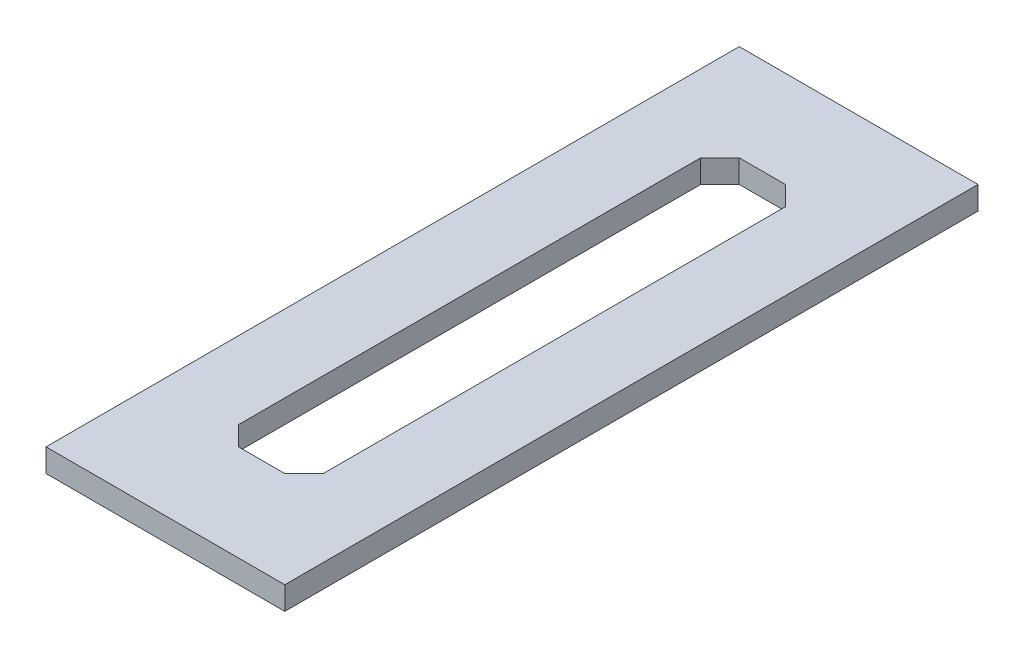
ISO-10303-21;
HEADER;
FILE_DESCRIPTION(('STEP AP214'),'2;1');
FILE_NAME('part.step','',(''),(''),'','','');
FILE_SCHEMA(('AUTOMOTIVE_DESIGN { 1 0 10303 214 1 1 1 1 }'));
ENDSEC;
DATA;
#1=APPLICATION_CONTEXT('core data for automotive mechanical design processes');
#2=APPLICATION_PROTOCOL_DEFINITION('international standard','automotive_design',2000,#1);
#3=PRODUCT_CONTEXT('',#1,'mechanical');
#4=PRODUCT('Part','Part','',(#3));
#5=PRODUCT_RELATED_PRODUCT_CATEGORY('part','',(#4));
#6=PRODUCT_DEFINITION_FORMATION('','',#4);
#7=PRODUCT_DEFINITION_CONTEXT('part definition',#1,'design');
#8=PRODUCT_DEFINITION('design','',#6,#7);
#9=PRODUCT_DEFINITION_SHAPE('','',#8);
#10=(LENGTH_UNIT() NAMED_UNIT(*) SI_UNIT(.MILLI.,.METRE.));
#11=(NAMED_UNIT(*) PLANE_ANGLE_UNIT() SI_UNIT($,.RADIAN.));
#12=(NAMED_UNIT(*) SI_UNIT($,.STERADIAN.) SOLID_ANGLE_UNIT());
#13=UNCERTAINTY_MEASURE_WITH_UNIT(LENGTH_MEASURE(1.E-05),#10,'distance_accuracy_value','');
#14=(GEOMETRIC_REPRESENTATION_CONTEXT(3) GLOBAL_UNCERTAINTY_ASSIGNED_CONTEXT((#13)) GLOBAL_UNIT_ASSIGNED_CONTEXT((#10,
#11,#12)) REPRESENTATION_CONTEXT('',''));
#15=CARTESIAN_POINT('',(0.,0.,0.));
#16=DIRECTION('',(0.,0.,1.));
#17=DIRECTION('',(1.,0.,0.));
#18=AXIS2_PLACEMENT_3D('',#15,#16,#17);
#19=CARTESIAN_POINT('',(0.,6.,0.));
#20=DIRECTION('',(0.,-1.,0.));
#21=DIRECTION('',(0.,0.,-1.));
#22=AXIS2_PLACEMENT_3D('',#19,#20,#21);
#23=PLANE('',#22);
#24=DIRECTION('',(0.,0.,1.));
#25=VECTOR('',#24,1.);
#26=CARTESIAN_POINT('',(-85.3503836317135,6.,70.2046035805626));
#27=LINE('',#26,#25);
#28=CARTESIAN_POINT('',(-85.3503836317135,6.,-109.795396419437));
#29=VERTEX_POINT('',#28);
#30=CARTESIAN_POINT('',(-85.3503836317135,6.,70.2046035805626));
#31=VERTEX_POINT('',#30);
#32=EDGE_CURVE('E222',#29,#31,#27,.T.);
#33=ORIENTED_EDGE('',*,*,#32,.T.);
#34=DIRECTION('',(1.,0.,0.));
#35=VECTOR('',#34,1.);
#36=CARTESIAN_POINT('',(-85.3503836317135,6.,70.2046035805626));
#37=LINE('',#36,#35);
#38=CARTESIAN_POINT('',(-23.3503836317135,6.,70.2046035805626));
#39=VERTEX_POINT('',#38);
#40=EDGE_CURVE('E226',#31,#39,#37,.T.);
#41=ORIENTED_EDGE('',*,*,#40,.T.);
#42=DIRECTION('',(0.,0.,-1.));
#43=VECTOR('',#42,1.);
#44=CARTESIAN_POINT('',(-23.3503836317135,6.,70.2046035805626));
#45=LINE('',#44,#43);
#46=CARTESIAN_POINT('',(-23.3503836317135,6.,-109.795396419437));
#47=VERTEX_POINT('',#46);
#48=EDGE_CURVE('E230',#39,#47,#45,.T.);
#49=ORIENTED_EDGE('',*,*,#48,.T.);
#50=DIRECTION('',(-1.,0.,0.));
#51=VECTOR('',#50,1.);
#52=CARTESIAN_POINT('',(-85.3503836317135,6.,-109.795396419437));
#53=LINE('',#52,#51);
#54=EDGE_CURVE('E233',#47,#29,#53,.T.);
#55=ORIENTED_EDGE('',*,*,#54,.T.);
#56=EDGE_LOOP('',(#33,#41,#49,#55));
#57=FACE_BOUND('',#56,.T.);
#58=DIRECTION('',(-1.,0.,0.));
#59=VECTOR('',#58,1.);
#60=CARTESIAN_POINT('',(-60.3503836317135,6.,-84.7953964194373));
#61=LINE('',#60,#59);
#62=CARTESIAN_POINT('',(-48.3503836317135,6.,-84.7953964194373));
#63=VERTEX_POINT('',#62);
#64=CARTESIAN_POINT('',(-60.3503836317135,6.,-84.7953964194373));
#65=VERTEX_POINT('',#64);
#66=EDGE_CURVE('E133',#63,#65,#61,.T.);
#67=ORIENTED_EDGE('',*,*,#66,.F.);
#68=DIRECTION('',(-0.707106781186547,0.,-0.707106781186548));
#69=VECTOR('',#68,1.);
#70=CARTESIAN_POINT('',(-48.3503836317135,6.,-84.7953964194373));
#71=LINE('',#70,#69);
#72=CARTESIAN_POINT('',(-43.3503836317135,6.,-79.7953964194373));
#73=VERTEX_POINT('',#72);
#74=EDGE_CURVE('E174',#73,#63,#71,.T.);
#75=ORIENTED_EDGE('',*,*,#74,.F.);
#76=DIRECTION('',(0.,0.,-1.));
#77=VECTOR('',#76,1.);
#78=CARTESIAN_POINT('',(-43.3503836317135,6.,40.2046035805627));
#79=LINE('',#78,#77);
#80=CARTESIAN_POINT('',(-43.3503836317135,6.,40.2046035805627));
#81=VERTEX_POINT('',#80);
#82=EDGE_CURVE('E171',#81,#73,#79,.T.);
#83=ORIENTED_EDGE('',*,*,#82,.F.);
#84=DIRECTION('',(0.707106781186548,0.,-0.707106781186547));
#85=VECTOR('',#84,1.);
#86=CARTESIAN_POINT('',(-48.3503836317135,6.,45.2046035805626));
#87=LINE('',#86,#85);
#88=CARTESIAN_POINT('',(-48.3503836317135,6.,45.2046035805626));
#89=VERTEX_POINT('',#88);
#90=EDGE_CURVE('E168',#89,#81,#87,.T.);
#91=ORIENTED_EDGE('',*,*,#90,.F.);
#92=DIRECTION('',(1.,0.,0.));
#93=VECTOR('',#92,1.);
#94=CARTESIAN_POINT('',(-60.3503836317135,6.,45.2046035805626));
#95=LINE('',#94,#93);
#96=CARTESIAN_POINT('',(-60.3503836317135,6.,45.2046035805626));
#97=VERTEX_POINT('',#96);
#98=EDGE_CURVE('E165',#97,#89,#95,.T.);
#99=ORIENTED_EDGE('',*,*,#98,.F.);
#100=DIRECTION('',(0.707106781186547,0.,0.707106781186547));
#101=VECTOR('',#100,1.);
#102=CARTESIAN_POINT('',(-60.3503836317135,6.,45.2046035805626));
#103=LINE('',#102,#101);
#104=CARTESIAN_POINT('',(-65.3503836317135,6.,40.2046035805626));
#105=VERTEX_POINT('',#104);
#106=EDGE_CURVE('E160',#105,#97,#103,.T.);
#107=ORIENTED_EDGE('',*,*,#106,.F.);
#108=DIRECTION('',(0.,0.,1.));
#109=VECTOR('',#108,1.);
#110=CARTESIAN_POINT('',(-65.3503836317135,6.,40.2046035805626));
#111=LINE('',#110,#109);
#112=CARTESIAN_POINT('',(-65.3503836317135,6.,-79.7953964194373));
#113=VERTEX_POINT('',#112);
#114=EDGE_CURVE('E156',#113,#105,#111,.T.);
#115=ORIENTED_EDGE('',*,*,#114,.F.);
#116=DIRECTION('',(-0.707106781186547,0.,0.707106781186548));
#117=VECTOR('',#116,1.);
#118=CARTESIAN_POINT('',(-65.3503836317135,6.,-79.7953964194373));
#119=LINE('',#118,#117);
#120=EDGE_CURVE('E142',#65,#113,#119,.T.);
#121=ORIENTED_EDGE('',*,*,#120,.F.);
#122=EDGE_LOOP('',(#67,#75,#83,#91,#99,#107,#115,#121));
#123=FACE_BOUND('',#122,.T.);
#124=ADVANCED_FACE('F43',(#57,#123),#23,.F.);
#125=CARTESIAN_POINT('',(0.,0.,0.));
#126=DIRECTION('',(0.,-1.,0.));
#127=DIRECTION('',(0.,0.,-1.));
#128=AXIS2_PLACEMENT_3D('',#125,#126,#127);
#129=PLANE('',#128);
#130=DIRECTION('',(0.,0.,1.));
#131=VECTOR('',#130,1.);
#132=CARTESIAN_POINT('',(-85.3503836317135,0.,70.2046035805626));
#133=LINE('',#132,#131);
#134=CARTESIAN_POINT('',(-85.3503836317135,0.,-109.795396419437));
#135=VERTEX_POINT('',#134);
#136=CARTESIAN_POINT('',(-85.3503836317135,0.,70.2046035805626));
#137=VERTEX_POINT('',#136);
#138=EDGE_CURVE('E151',#135,#137,#133,.T.);
#139=ORIENTED_EDGE('',*,*,#138,.F.);
#140=DIRECTION('',(-1.,0.,0.));
#141=VECTOR('',#140,1.);
#142=CARTESIAN_POINT('',(-85.3503836317135,0.,-109.795396419437));
#143=LINE('',#142,#141);
#144=CARTESIAN_POINT('',(-23.3503836317135,0.,-109.795396419437));
#145=VERTEX_POINT('',#144);
#146=EDGE_CURVE('E227',#145,#135,#143,.T.);
#147=ORIENTED_EDGE('',*,*,#146,.F.);
#148=DIRECTION('',(0.,0.,-1.));
#149=VECTOR('',#148,1.);
#150=CARTESIAN_POINT('',(-23.3503836317135,0.,70.2046035805626));
#151=LINE('',#150,#149);
#152=CARTESIAN_POINT('',(-23.3503836317135,0.,70.2046035805626));
#153=VERTEX_POINT('',#152);
#154=EDGE_CURVE('E243',#153,#145,#151,.T.);
#155=ORIENTED_EDGE('',*,*,#154,.F.);
#156=DIRECTION('',(1.,0.,0.));
#157=VECTOR('',#156,1.);
#158=CARTESIAN_POINT('',(-85.3503836317135,0.,70.2046035805626));
#159=LINE('',#158,#157);
#160=EDGE_CURVE('E240',#137,#153,#159,.T.);
#161=ORIENTED_EDGE('',*,*,#160,.F.);
#162=EDGE_LOOP('',(#139,#147,#155,#161));
#163=FACE_BOUND('',#162,.T.);
#164=DIRECTION('',(-0.707106781186547,0.,-0.707106781186548));
#165=VECTOR('',#164,1.);
#166=CARTESIAN_POINT('',(-48.3503836317135,0.,-84.7953964194373));
#167=LINE('',#166,#165);
#168=CARTESIAN_POINT('',(-43.3503836317135,0.,-79.7953964194373));
#169=VERTEX_POINT('',#168);
#170=CARTESIAN_POINT('',(-48.3503836317135,0.,-84.7953964194373));
#171=VERTEX_POINT('',#170);
#172=EDGE_CURVE('E143',#169,#171,#167,.T.);
#173=ORIENTED_EDGE('',*,*,#172,.T.);
#174=DIRECTION('',(-1.,0.,0.));
#175=VECTOR('',#174,1.);
#176=CARTESIAN_POINT('',(-60.3503836317135,0.,-84.7953964194373));
#177=LINE('',#176,#175);
#178=CARTESIAN_POINT('',(-60.3503836317135,0.,-84.7953964194373));
#179=VERTEX_POINT('',#178);
#180=EDGE_CURVE('E67',#171,#179,#177,.T.);
#181=ORIENTED_EDGE('',*,*,#180,.T.);
#182=DIRECTION('',(-0.707106781186547,0.,0.707106781186548));
#183=VECTOR('',#182,1.);
#184=CARTESIAN_POINT('',(-65.3503836317135,0.,-79.7953964194373));
#185=LINE('',#184,#183);
#186=CARTESIAN_POINT('',(-65.3503836317135,0.,-79.7953964194373));
#187=VERTEX_POINT('',#186);
#188=EDGE_CURVE('E149',#179,#187,#185,.T.);
#189=ORIENTED_EDGE('',*,*,#188,.T.);
#190=DIRECTION('',(0.,0.,1.));
#191=VECTOR('',#190,1.);
#192=CARTESIAN_POINT('',(-65.3503836317135,0.,40.2046035805626));
#193=LINE('',#192,#191);
#194=CARTESIAN_POINT('',(-65.3503836317135,0.,40.2046035805626));
#195=VERTEX_POINT('',#194);
#196=EDGE_CURVE('E181',#187,#195,#193,.T.);
#197=ORIENTED_EDGE('',*,*,#196,.T.);
#198=DIRECTION('',(0.707106781186547,0.,0.707106781186547));
#199=VECTOR('',#198,1.);
#200=CARTESIAN_POINT('',(-60.3503836317135,0.,45.2046035805626));
#201=LINE('',#200,#199);
#202=CARTESIAN_POINT('',(-60.3503836317135,0.,45.2046035805626));
#203=VERTEX_POINT('',#202);
#204=EDGE_CURVE('E185',#195,#203,#201,.T.);
#205=ORIENTED_EDGE('',*,*,#204,.T.);
#206=DIRECTION('',(1.,0.,0.));
#207=VECTOR('',#206,1.);
#208=CARTESIAN_POINT('',(-60.3503836317135,0.,45.2046035805626));
#209=LINE('',#208,#207);
#210=CARTESIAN_POINT('',(-48.3503836317135,0.,45.2046035805626));
#211=VERTEX_POINT('',#210);
#212=EDGE_CURVE('E189',#203,#211,#209,.T.);
#213=ORIENTED_EDGE('',*,*,#212,.T.);
#214=DIRECTION('',(0.707106781186548,0.,-0.707106781186547));
#215=VECTOR('',#214,1.);
#216=CARTESIAN_POINT('',(-48.3503836317135,0.,45.2046035805626));
#217=LINE('',#216,#215);
#218=CARTESIAN_POINT('',(-43.3503836317135,0.,40.2046035805627));
#219=VERTEX_POINT('',#218);
#220=EDGE_CURVE('E193',#211,#219,#217,.T.);
#221=ORIENTED_EDGE('',*,*,#220,.T.);
#222=DIRECTION('',(0.,0.,-1.));
#223=VECTOR('',#222,1.);
#224=CARTESIAN_POINT('',(-43.3503836317135,0.,40.2046035805627));
#225=LINE('',#224,#223);
#226=EDGE_CURVE('E197',#219,#169,#225,.T.);
#227=ORIENTED_EDGE('',*,*,#226,.T.);
#228=EDGE_LOOP('',(#173,#181,#189,#197,#205,#213,#221,#227));
#229=FACE_BOUND('',#228,.T.);
#230=ADVANCED_FACE('F266',(#163,#229),#129,.T.);
#231=CARTESIAN_POINT('',(-85.3503836317135,6.,70.2046035805626));
#232=DIRECTION('',(1.,0.,0.));
#233=DIRECTION('',(0.,0.,-1.));
#234=AXIS2_PLACEMENT_3D('',#231,#232,#233);
#235=PLANE('',#234);
#236=ORIENTED_EDGE('',*,*,#138,.T.);
#237=DIRECTION('',(0.,-1.,0.));
#238=VECTOR('',#237,1.);
#239=CARTESIAN_POINT('',(-85.3503836317135,6.,70.2046035805626));
#240=LINE('',#239,#238);
#241=EDGE_CURVE('E11',#31,#137,#240,.T.);
#242=ORIENTED_EDGE('',*,*,#241,.F.);
#243=ORIENTED_EDGE('',*,*,#32,.F.);
#244=DIRECTION('',(0.,-1.,0.));
#245=VECTOR('',#244,1.);
#246=CARTESIAN_POINT('',(-85.3503836317135,6.,-109.795396419437));
#247=LINE('',#246,#245);
#248=EDGE_CURVE('E236',#29,#135,#247,.T.);
#249=ORIENTED_EDGE('',*,*,#248,.T.);
#250=EDGE_LOOP('',(#236,#242,#243,#249));
#251=FACE_BOUND('',#250,.T.);
#252=ADVANCED_FACE('F45',(#251),#235,.F.);
#253=CARTESIAN_POINT('',(-85.3503836317135,6.,70.2046035805626));
#254=DIRECTION('',(0.,0.,-1.));
#255=DIRECTION('',(-1.,0.,0.));
#256=AXIS2_PLACEMENT_3D('',#253,#254,#255);
#257=PLANE('',#256);
#258=ORIENTED_EDGE('',*,*,#160,.T.);
#259=DIRECTION('',(0.,-1.,0.));
#260=VECTOR('',#259,1.);
#261=CARTESIAN_POINT('',(-23.3503836317135,6.,70.2046035805626));
#262=LINE('',#261,#260);
#263=EDGE_CURVE('E52',#39,#153,#262,.T.);
#264=ORIENTED_EDGE('',*,*,#263,.F.);
#265=ORIENTED_EDGE('',*,*,#40,.F.);
#266=ORIENTED_EDGE('',*,*,#241,.T.);
#267=EDGE_LOOP('',(#258,#264,#265,#266));
#268=FACE_BOUND('',#267,.T.);
#269=ADVANCED_FACE('F276',(#268),#257,.F.);
#270=CARTESIAN_POINT('',(-23.3503836317135,6.,70.2046035805626));
#271=DIRECTION('',(-1.,0.,0.));
#272=DIRECTION('',(0.,0.,1.));
#273=AXIS2_PLACEMENT_3D('',#270,#271,#272);
#274=PLANE('',#273);
#275=ORIENTED_EDGE('',*,*,#154,.T.);
#276=DIRECTION('',(0.,-1.,0.));
#277=VECTOR('',#276,1.);
#278=CARTESIAN_POINT('',(-23.3503836317135,6.,-109.795396419437));
#279=LINE('',#278,#277);
#280=EDGE_CURVE('E251',#47,#145,#279,.T.);
#281=ORIENTED_EDGE('',*,*,#280,.F.);
#282=ORIENTED_EDGE('',*,*,#48,.F.);
#283=ORIENTED_EDGE('',*,*,#263,.T.);
#284=EDGE_LOOP('',(#275,#281,#282,#283));
#285=FACE_BOUND('',#284,.T.);
#286=ADVANCED_FACE('F260',(#285),#274,.F.);
#287=CARTESIAN_POINT('',(-85.3503836317135,6.,-109.795396419437));
#288=DIRECTION('',(0.,0.,1.));
#289=DIRECTION('',(1.,0.,0.));
#290=AXIS2_PLACEMENT_3D('',#287,#288,#289);
#291=PLANE('',#290);
#292=ORIENTED_EDGE('',*,*,#146,.T.);
#293=ORIENTED_EDGE('',*,*,#248,.F.);
#294=ORIENTED_EDGE('',*,*,#54,.F.);
#295=ORIENTED_EDGE('',*,*,#280,.T.);
#296=EDGE_LOOP('',(#292,#293,#294,#295));
#297=FACE_BOUND('',#296,.T.);
#298=ADVANCED_FACE('F270',(#297),#291,.F.);
#299=CARTESIAN_POINT('',(-60.3503836317135,6.,-84.7953964194373));
#300=DIRECTION('',(0.,0.,1.));
#301=DIRECTION('',(1.,0.,0.));
#302=AXIS2_PLACEMENT_3D('',#299,#300,#301);
#303=PLANE('',#302);
#304=ORIENTED_EDGE('',*,*,#180,.F.);
#305=DIRECTION('',(0.,-1.,0.));
#306=VECTOR('',#305,1.);
#307=CARTESIAN_POINT('',(-48.3503836317135,6.,-84.7953964194373));
#308=LINE('',#307,#306);
#309=EDGE_CURVE('E137',#63,#171,#308,.T.);
#310=ORIENTED_EDGE('',*,*,#309,.F.);
#311=ORIENTED_EDGE('',*,*,#66,.T.);
#312=DIRECTION('',(0.,-1.,0.));
#313=VECTOR('',#312,1.);
#314=CARTESIAN_POINT('',(-60.3503836317135,6.,-84.7953964194373));
#315=LINE('',#314,#313);
#316=EDGE_CURVE('E136',#65,#179,#315,.T.);
#317=ORIENTED_EDGE('',*,*,#316,.T.);
#318=EDGE_LOOP('',(#304,#310,#311,#317));
#319=FACE_BOUND('',#318,.T.);
#320=ADVANCED_FACE('F135',(#319),#303,.T.);
#321=CARTESIAN_POINT('',(-65.3503836317135,6.,-79.7953964194373));
#322=DIRECTION('',(0.707106781186548,0.,0.707106781186547));
#323=DIRECTION('',(0.707106781186547,0.,-0.707106781186548));
#324=AXIS2_PLACEMENT_3D('',#321,#322,#323);
#325=PLANE('',#324);
#326=ORIENTED_EDGE('',*,*,#188,.F.);
#327=ORIENTED_EDGE('',*,*,#316,.F.);
#328=ORIENTED_EDGE('',*,*,#120,.T.);
#329=DIRECTION('',(0.,-1.,0.));
#330=VECTOR('',#329,1.);
#331=CARTESIAN_POINT('',(-65.3503836317135,6.,-79.7953964194373));
#332=LINE('',#331,#330);
#333=EDGE_CURVE('E152',#113,#187,#332,.T.);
#334=ORIENTED_EDGE('',*,*,#333,.T.);
#335=EDGE_LOOP('',(#326,#327,#328,#334));
#336=FACE_BOUND('',#335,.T.);
#337=ADVANCED_FACE('F146',(#336),#325,.T.);
#338=CARTESIAN_POINT('',(-65.3503836317135,6.,40.2046035805626));
#339=DIRECTION('',(1.,0.,0.));
#340=DIRECTION('',(0.,0.,-1.));
#341=AXIS2_PLACEMENT_3D('',#338,#339,#340);
#342=PLANE('',#341);
#343=ORIENTED_EDGE('',*,*,#196,.F.);
#344=ORIENTED_EDGE('',*,*,#333,.F.);
#345=ORIENTED_EDGE('',*,*,#114,.T.);
#346=DIRECTION('',(0.,-1.,0.));
#347=VECTOR('',#346,1.);
#348=CARTESIAN_POINT('',(-65.3503836317135,6.,40.2046035805626));
#349=LINE('',#348,#347);
#350=EDGE_CURVE('E217',#105,#195,#349,.T.);
#351=ORIENTED_EDGE('',*,*,#350,.T.);
#352=EDGE_LOOP('',(#343,#344,#345,#351));
#353=FACE_BOUND('',#352,.T.);
#354=ADVANCED_FACE('F299',(#353),#342,.T.);
#355=CARTESIAN_POINT('',(-60.3503836317135,6.,45.2046035805626));
#356=DIRECTION('',(0.707106781186548,0.,-0.707106781186548));
#357=DIRECTION('',(-0.707106781186548,0.,-0.707106781186548));
#358=AXIS2_PLACEMENT_3D('',#355,#356,#357);
#359=PLANE('',#358);
#360=ORIENTED_EDGE('',*,*,#204,.F.);
#361=ORIENTED_EDGE('',*,*,#350,.F.);
#362=ORIENTED_EDGE('',*,*,#106,.T.);
#363=DIRECTION('',(0.,-1.,0.));
#364=VECTOR('',#363,1.);
#365=CARTESIAN_POINT('',(-60.3503836317135,6.,45.2046035805626));
#366=LINE('',#365,#364);
#367=EDGE_CURVE('E214',#97,#203,#366,.T.);
#368=ORIENTED_EDGE('',*,*,#367,.T.);
#369=EDGE_LOOP('',(#360,#361,#362,#368));
#370=FACE_BOUND('',#369,.T.);
#371=ADVANCED_FACE('F303',(#370),#359,.T.);
#372=CARTESIAN_POINT('',(-60.3503836317135,6.,45.2046035805626));
#373=DIRECTION('',(0.,0.,-1.));
#374=DIRECTION('',(-1.,0.,0.));
#375=AXIS2_PLACEMENT_3D('',#372,#373,#374);
#376=PLANE('',#375);
#377=ORIENTED_EDGE('',*,*,#212,.F.);
#378=ORIENTED_EDGE('',*,*,#367,.F.);
#379=ORIENTED_EDGE('',*,*,#98,.T.);
#380=DIRECTION('',(0.,-1.,0.));
#381=VECTOR('',#380,1.);
#382=CARTESIAN_POINT('',(-48.3503836317135,6.,45.2046035805626));
#383=LINE('',#382,#381);
#384=EDGE_CURVE('E211',#89,#211,#383,.T.);
#385=ORIENTED_EDGE('',*,*,#384,.T.);
#386=EDGE_LOOP('',(#377,#378,#379,#385));
#387=FACE_BOUND('',#386,.T.);
#388=ADVANCED_FACE('F309',(#387),#376,.T.);
#389=CARTESIAN_POINT('',(-48.3503836317135,6.,45.2046035805626));
#390=DIRECTION('',(-0.707106781186547,0.,-0.707106781186548));
#391=DIRECTION('',(-0.707106781186548,0.,0.707106781186547));
#392=AXIS2_PLACEMENT_3D('',#389,#390,#391);
#393=PLANE('',#392);
#394=ORIENTED_EDGE('',*,*,#220,.F.);
#395=ORIENTED_EDGE('',*,*,#384,.F.);
#396=ORIENTED_EDGE('',*,*,#90,.T.);
#397=DIRECTION('',(0.,-1.,0.));
#398=VECTOR('',#397,1.);
#399=CARTESIAN_POINT('',(-43.3503836317135,6.,40.2046035805627));
#400=LINE('',#399,#398);
#401=EDGE_CURVE('E208',#81,#219,#400,.T.);
#402=ORIENTED_EDGE('',*,*,#401,.T.);
#403=EDGE_LOOP('',(#394,#395,#396,#402));
#404=FACE_BOUND('',#403,.T.);
#405=ADVANCED_FACE('F313',(#404),#393,.T.);
#406=CARTESIAN_POINT('',(-43.3503836317135,6.,40.2046035805627));
#407=DIRECTION('',(-1.,0.,0.));
#408=DIRECTION('',(0.,0.,1.));
#409=AXIS2_PLACEMENT_3D('',#406,#407,#408);
#410=PLANE('',#409);
#411=ORIENTED_EDGE('',*,*,#226,.F.);
#412=ORIENTED_EDGE('',*,*,#401,.F.);
#413=ORIENTED_EDGE('',*,*,#82,.T.);
#414=DIRECTION('',(0.,-1.,0.));
#415=VECTOR('',#414,1.);
#416=CARTESIAN_POINT('',(-43.3503836317135,6.,-79.7953964194373));
#417=LINE('',#416,#415);
#418=EDGE_CURVE('E59',#73,#169,#417,.T.);
#419=ORIENTED_EDGE('',*,*,#418,.T.);
#420=EDGE_LOOP('',(#411,#412,#413,#419));
#421=FACE_BOUND('',#420,.T.);
#422=ADVANCED_FACE('F317',(#421),#410,.T.);
#423=CARTESIAN_POINT('',(-48.3503836317135,6.,-84.7953964194373));
#424=DIRECTION('',(-0.707106781186548,0.,0.707106781186547));
#425=DIRECTION('',(0.707106781186547,0.,0.707106781186548));
#426=AXIS2_PLACEMENT_3D('',#423,#424,#425);
#427=PLANE('',#426);
#428=ORIENTED_EDGE('',*,*,#172,.F.);
#429=ORIENTED_EDGE('',*,*,#418,.F.);
#430=ORIENTED_EDGE('',*,*,#74,.T.);
#431=ORIENTED_EDGE('',*,*,#309,.T.);
#432=EDGE_LOOP('',(#428,#429,#430,#431));
#433=FACE_BOUND('',#432,.T.);
#434=ADVANCED_FACE('F321',(#433),#427,.T.);
#435=CLOSED_SHELL('',(#124,#230,#252,#269,#286,#298,#320,#337,#354,#371,#388,#405,#422,#434));
#436=MANIFOLD_SOLID_BREP('B2',#435);
#437=ADVANCED_BREP_SHAPE_REPRESENTATION('',(#18,#436),#14);
#438=SHAPE_DEFINITION_REPRESENTATION(#9,#437);
ENDSEC;
END-ISO-10303-21;
